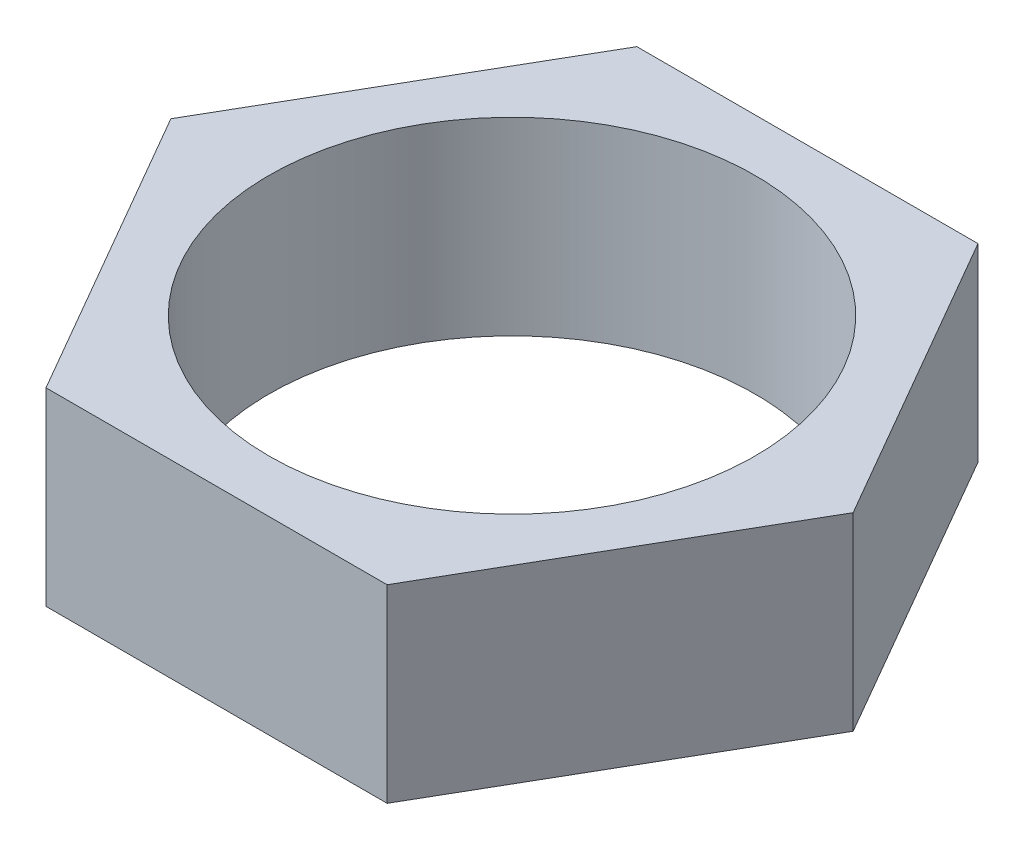
ISO-10303-21;
HEADER;
FILE_DESCRIPTION(('STEP AP214'),'2;1');
FILE_NAME('part.step','',(''),(''),'','','');
FILE_SCHEMA(('AUTOMOTIVE_DESIGN { 1 0 10303 214 1 1 1 1 }'));
ENDSEC;
DATA;
#1=APPLICATION_CONTEXT('core data for automotive mechanical design processes');
#2=APPLICATION_PROTOCOL_DEFINITION('international standard','automotive_design',2000,#1);
#3=PRODUCT_CONTEXT('',#1,'mechanical');
#4=PRODUCT('Part','Part','',(#3));
#5=PRODUCT_RELATED_PRODUCT_CATEGORY('part','',(#4));
#6=PRODUCT_DEFINITION_FORMATION('','',#4);
#7=PRODUCT_DEFINITION_CONTEXT('part definition',#1,'design');
#8=PRODUCT_DEFINITION('design','',#6,#7);
#9=PRODUCT_DEFINITION_SHAPE('','',#8);
#10=(LENGTH_UNIT() NAMED_UNIT(*) SI_UNIT(.MILLI.,.METRE.));
#11=(NAMED_UNIT(*) PLANE_ANGLE_UNIT() SI_UNIT($,.RADIAN.));
#12=(NAMED_UNIT(*) SI_UNIT($,.STERADIAN.) SOLID_ANGLE_UNIT());
#13=UNCERTAINTY_MEASURE_WITH_UNIT(LENGTH_MEASURE(1.E-05),#10,'distance_accuracy_value','');
#14=(GEOMETRIC_REPRESENTATION_CONTEXT(3) GLOBAL_UNCERTAINTY_ASSIGNED_CONTEXT((#13)) GLOBAL_UNIT_ASSIGNED_CONTEXT((#10,
#11,#12)) REPRESENTATION_CONTEXT('',''));
#15=CARTESIAN_POINT('',(0.,0.,0.));
#16=DIRECTION('',(0.,0.,1.));
#17=DIRECTION('',(1.,0.,0.));
#18=AXIS2_PLACEMENT_3D('',#15,#16,#17);
#19=CARTESIAN_POINT('',(3.59285072516704,-1.9939,-6.223));
#20=DIRECTION('',(0.,0.,-1.));
#21=DIRECTION('',(-1.,0.,0.));
#22=AXIS2_PLACEMENT_3D('',#19,#20,#21);
#23=PLANE('',#22);
#24=DIRECTION('',(0.,1.,0.));
#25=VECTOR('',#24,1.);
#26=CARTESIAN_POINT('',(-3.59285072516704,-1.9939,-6.223));
#27=LINE('',#26,#25);
#28=CARTESIAN_POINT('',(-3.59285072516704,-1.9939,-6.223));
#29=VERTEX_POINT('',#28);
#30=CARTESIAN_POINT('',(-3.59285072516704,1.9939,-6.223));
#31=VERTEX_POINT('',#30);
#32=EDGE_CURVE('E56',#29,#31,#27,.T.);
#33=ORIENTED_EDGE('',*,*,#32,.T.);
#34=DIRECTION('',(-1.,0.,0.));
#35=VECTOR('',#34,1.);
#36=CARTESIAN_POINT('',(3.59285072516704,1.9939,-6.223));
#37=LINE('',#36,#35);
#38=CARTESIAN_POINT('',(3.59285072516704,1.9939,-6.223));
#39=VERTEX_POINT('',#38);
#40=EDGE_CURVE('E105',#39,#31,#37,.T.);
#41=ORIENTED_EDGE('',*,*,#40,.F.);
#42=DIRECTION('',(0.,1.,0.));
#43=VECTOR('',#42,1.);
#44=CARTESIAN_POINT('',(3.59285072516704,-1.9939,-6.223));
#45=LINE('',#44,#43);
#46=CARTESIAN_POINT('',(3.59285072516704,-1.9939,-6.223));
#47=VERTEX_POINT('',#46);
#48=EDGE_CURVE('E11',#47,#39,#45,.T.);
#49=ORIENTED_EDGE('',*,*,#48,.F.);
#50=DIRECTION('',(-1.,0.,0.));
#51=VECTOR('',#50,1.);
#52=CARTESIAN_POINT('',(3.59285072516704,-1.9939,-6.223));
#53=LINE('',#52,#51);
#54=EDGE_CURVE('E106',#47,#29,#53,.T.);
#55=ORIENTED_EDGE('',*,*,#54,.T.);
#56=EDGE_LOOP('',(#33,#41,#49,#55));
#57=FACE_BOUND('',#56,.T.);
#58=ADVANCED_FACE('F53',(#57),#23,.T.);
#59=CARTESIAN_POINT('',(7.18570145033408,-1.9939,0.));
#60=DIRECTION('',(0.866025403784439,0.,-0.5));
#61=DIRECTION('',(-0.5,0.,-0.866025403784439));
#62=AXIS2_PLACEMENT_3D('',#59,#60,#61);
#63=PLANE('',#62);
#64=ORIENTED_EDGE('',*,*,#48,.T.);
#65=DIRECTION('',(-0.5,0.,-0.866025403784439));
#66=VECTOR('',#65,1.);
#67=CARTESIAN_POINT('',(7.18570145033408,1.9939,0.));
#68=LINE('',#67,#66);
#69=CARTESIAN_POINT('',(7.18570145033408,1.9939,0.));
#70=VERTEX_POINT('',#69);
#71=EDGE_CURVE('E124',#70,#39,#68,.T.);
#72=ORIENTED_EDGE('',*,*,#71,.F.);
#73=DIRECTION('',(0.,1.,0.));
#74=VECTOR('',#73,1.);
#75=CARTESIAN_POINT('',(7.18570145033408,-1.9939,0.));
#76=LINE('',#75,#74);
#77=CARTESIAN_POINT('',(7.18570145033408,-1.9939,0.));
#78=VERTEX_POINT('',#77);
#79=EDGE_CURVE('E61',#78,#70,#76,.T.);
#80=ORIENTED_EDGE('',*,*,#79,.F.);
#81=DIRECTION('',(-0.5,0.,-0.866025403784439));
#82=VECTOR('',#81,1.);
#83=CARTESIAN_POINT('',(7.18570145033408,-1.9939,0.));
#84=LINE('',#83,#82);
#85=EDGE_CURVE('E111',#78,#47,#84,.T.);
#86=ORIENTED_EDGE('',*,*,#85,.T.);
#87=EDGE_LOOP('',(#64,#72,#80,#86));
#88=FACE_BOUND('',#87,.T.);
#89=ADVANCED_FACE('F173',(#88),#63,.T.);
#90=CARTESIAN_POINT('',(3.59285072516705,-1.9939,6.223));
#91=DIRECTION('',(0.866025403784439,0.,0.5));
#92=DIRECTION('',(0.5,0.,-0.866025403784439));
#93=AXIS2_PLACEMENT_3D('',#90,#91,#92);
#94=PLANE('',#93);
#95=ORIENTED_EDGE('',*,*,#79,.T.);
#96=DIRECTION('',(0.5,0.,-0.866025403784439));
#97=VECTOR('',#96,1.);
#98=CARTESIAN_POINT('',(3.59285072516705,1.9939,6.223));
#99=LINE('',#98,#97);
#100=CARTESIAN_POINT('',(3.59285072516705,1.9939,6.223));
#101=VERTEX_POINT('',#100);
#102=EDGE_CURVE('E135',#101,#70,#99,.T.);
#103=ORIENTED_EDGE('',*,*,#102,.F.);
#104=DIRECTION('',(0.,1.,0.));
#105=VECTOR('',#104,1.);
#106=CARTESIAN_POINT('',(3.59285072516705,-1.9939,6.223));
#107=LINE('',#106,#105);
#108=CARTESIAN_POINT('',(3.59285072516705,-1.9939,6.223));
#109=VERTEX_POINT('',#108);
#110=EDGE_CURVE('E156',#109,#101,#107,.T.);
#111=ORIENTED_EDGE('',*,*,#110,.F.);
#112=DIRECTION('',(0.5,0.,-0.866025403784439));
#113=VECTOR('',#112,1.);
#114=CARTESIAN_POINT('',(3.59285072516705,-1.9939,6.223));
#115=LINE('',#114,#113);
#116=EDGE_CURVE('E152',#109,#78,#115,.T.);
#117=ORIENTED_EDGE('',*,*,#116,.T.);
#118=EDGE_LOOP('',(#95,#103,#111,#117));
#119=FACE_BOUND('',#118,.T.);
#120=ADVANCED_FACE('F169',(#119),#94,.T.);
#121=CARTESIAN_POINT('',(-3.59285072516704,-1.9939,6.223));
#122=DIRECTION('',(0.,0.,1.));
#123=DIRECTION('',(1.,0.,0.));
#124=AXIS2_PLACEMENT_3D('',#121,#122,#123);
#125=PLANE('',#124);
#126=ORIENTED_EDGE('',*,*,#110,.T.);
#127=DIRECTION('',(1.,0.,0.));
#128=VECTOR('',#127,1.);
#129=CARTESIAN_POINT('',(-3.59285072516704,1.9939,6.223));
#130=LINE('',#129,#128);
#131=CARTESIAN_POINT('',(-3.59285072516704,1.9939,6.223));
#132=VERTEX_POINT('',#131);
#133=EDGE_CURVE('E132',#132,#101,#130,.T.);
#134=ORIENTED_EDGE('',*,*,#133,.F.);
#135=DIRECTION('',(0.,1.,0.));
#136=VECTOR('',#135,1.);
#137=CARTESIAN_POINT('',(-3.59285072516704,-1.9939,6.223));
#138=LINE('',#137,#136);
#139=CARTESIAN_POINT('',(-3.59285072516704,-1.9939,6.223));
#140=VERTEX_POINT('',#139);
#141=EDGE_CURVE('E158',#140,#132,#138,.T.);
#142=ORIENTED_EDGE('',*,*,#141,.F.);
#143=DIRECTION('',(1.,0.,0.));
#144=VECTOR('',#143,1.);
#145=CARTESIAN_POINT('',(-3.59285072516704,-1.9939,6.223));
#146=LINE('',#145,#144);
#147=EDGE_CURVE('E148',#140,#109,#146,.T.);
#148=ORIENTED_EDGE('',*,*,#147,.T.);
#149=EDGE_LOOP('',(#126,#134,#142,#148));
#150=FACE_BOUND('',#149,.T.);
#151=ADVANCED_FACE('F166',(#150),#125,.T.);
#152=CARTESIAN_POINT('',(-7.18570145033408,-1.9939,0.));
#153=DIRECTION('',(-0.866025403784438,0.,0.5));
#154=DIRECTION('',(0.5,0.,0.866025403784438));
#155=AXIS2_PLACEMENT_3D('',#152,#153,#154);
#156=PLANE('',#155);
#157=ORIENTED_EDGE('',*,*,#141,.T.);
#158=DIRECTION('',(0.5,0.,0.866025403784438));
#159=VECTOR('',#158,1.);
#160=CARTESIAN_POINT('',(-7.18570145033408,1.9939,0.));
#161=LINE('',#160,#159);
#162=CARTESIAN_POINT('',(-7.18570145033408,1.9939,0.));
#163=VERTEX_POINT('',#162);
#164=EDGE_CURVE('E118',#163,#132,#161,.T.);
#165=ORIENTED_EDGE('',*,*,#164,.F.);
#166=DIRECTION('',(0.,1.,0.));
#167=VECTOR('',#166,1.);
#168=CARTESIAN_POINT('',(-7.18570145033408,-1.9939,0.));
#169=LINE('',#168,#167);
#170=CARTESIAN_POINT('',(-7.18570145033408,-1.9939,0.));
#171=VERTEX_POINT('',#170);
#172=EDGE_CURVE('E110',#171,#163,#169,.T.);
#173=ORIENTED_EDGE('',*,*,#172,.F.);
#174=DIRECTION('',(0.5,0.,0.866025403784438));
#175=VECTOR('',#174,1.);
#176=CARTESIAN_POINT('',(-7.18570145033408,-1.9939,0.));
#177=LINE('',#176,#175);
#178=EDGE_CURVE('E145',#171,#140,#177,.T.);
#179=ORIENTED_EDGE('',*,*,#178,.T.);
#180=EDGE_LOOP('',(#157,#165,#173,#179));
#181=FACE_BOUND('',#180,.T.);
#182=ADVANCED_FACE('F160',(#181),#156,.T.);
#183=CARTESIAN_POINT('',(-3.59285072516704,-1.9939,-6.223));
#184=DIRECTION('',(-0.866025403784439,0.,-0.5));
#185=DIRECTION('',(-0.5,0.,0.866025403784439));
#186=AXIS2_PLACEMENT_3D('',#183,#184,#185);
#187=PLANE('',#186);
#188=ORIENTED_EDGE('',*,*,#172,.T.);
#189=DIRECTION('',(-0.5,0.,0.866025403784439));
#190=VECTOR('',#189,1.);
#191=CARTESIAN_POINT('',(-3.59285072516704,1.9939,-6.223));
#192=LINE('',#191,#190);
#193=EDGE_CURVE('E113',#31,#163,#192,.T.);
#194=ORIENTED_EDGE('',*,*,#193,.F.);
#195=ORIENTED_EDGE('',*,*,#32,.F.);
#196=DIRECTION('',(-0.5,0.,0.866025403784439));
#197=VECTOR('',#196,1.);
#198=CARTESIAN_POINT('',(-3.59285072516704,-1.9939,-6.223));
#199=LINE('',#198,#197);
#200=EDGE_CURVE('E143',#29,#171,#199,.T.);
#201=ORIENTED_EDGE('',*,*,#200,.T.);
#202=EDGE_LOOP('',(#188,#194,#195,#201));
#203=FACE_BOUND('',#202,.T.);
#204=ADVANCED_FACE('F114',(#203),#187,.T.);
#205=CARTESIAN_POINT('',(0.,-1.9939,0.));
#206=DIRECTION('',(0.,1.,0.));
#207=DIRECTION('',(0.,0.,1.));
#208=AXIS2_PLACEMENT_3D('',#205,#206,#207);
#209=PLANE('',#208);
#210=CARTESIAN_POINT('',(0.,-1.9939,0.));
#211=DIRECTION('',(0.,1.,0.));
#212=DIRECTION('',(0.,0.,1.));
#213=AXIS2_PLACEMENT_3D('',#210,#211,#212);
#214=CIRCLE('',#213,5.12);
#215=CARTESIAN_POINT('',(0.,-1.9939,5.12));
#216=VERTEX_POINT('',#215);
#217=EDGE_CURVE('E139',#216,#216,#214,.T.);
#218=ORIENTED_EDGE('',*,*,#217,.T.);
#219=EDGE_LOOP('',(#218));
#220=FACE_BOUND('',#219,.T.);
#221=ORIENTED_EDGE('',*,*,#54,.F.);
#222=ORIENTED_EDGE('',*,*,#85,.F.);
#223=ORIENTED_EDGE('',*,*,#116,.F.);
#224=ORIENTED_EDGE('',*,*,#147,.F.);
#225=ORIENTED_EDGE('',*,*,#178,.F.);
#226=ORIENTED_EDGE('',*,*,#200,.F.);
#227=EDGE_LOOP('',(#221,#222,#223,#224,#225,#226));
#228=FACE_BOUND('',#227,.T.);
#229=ADVANCED_FACE('F172',(#220,#228),#209,.F.);
#230=CARTESIAN_POINT('',(0.,-1.9939,0.));
#231=DIRECTION('',(0.,1.,0.));
#232=DIRECTION('',(0.,0.,1.));
#233=AXIS2_PLACEMENT_3D('',#230,#231,#232);
#234=CYLINDRICAL_SURFACE('',#233,5.12);
#235=ORIENTED_EDGE('',*,*,#217,.F.);
#236=EDGE_LOOP('',(#235));
#237=FACE_BOUND('',#236,.T.);
#238=CARTESIAN_POINT('',(0.,1.9939,0.));
#239=DIRECTION('',(0.,1.,0.));
#240=DIRECTION('',(0.,0.,1.));
#241=AXIS2_PLACEMENT_3D('',#238,#239,#240);
#242=CIRCLE('',#241,5.12);
#243=CARTESIAN_POINT('',(0.,1.9939,5.12));
#244=VERTEX_POINT('',#243);
#245=EDGE_CURVE('E125',#244,#244,#242,.T.);
#246=ORIENTED_EDGE('',*,*,#245,.T.);
#247=EDGE_LOOP('',(#246));
#248=FACE_BOUND('',#247,.T.);
#249=ADVANCED_FACE('F191',(#237,#248),#234,.F.);
#250=CARTESIAN_POINT('',(0.,1.9939,0.));
#251=DIRECTION('',(0.,1.,0.));
#252=DIRECTION('',(0.,0.,1.));
#253=AXIS2_PLACEMENT_3D('',#250,#251,#252);
#254=PLANE('',#253);
#255=ORIENTED_EDGE('',*,*,#40,.T.);
#256=ORIENTED_EDGE('',*,*,#193,.T.);
#257=ORIENTED_EDGE('',*,*,#164,.T.);
#258=ORIENTED_EDGE('',*,*,#133,.T.);
#259=ORIENTED_EDGE('',*,*,#102,.T.);
#260=ORIENTED_EDGE('',*,*,#71,.T.);
#261=EDGE_LOOP('',(#255,#256,#257,#258,#259,#260));
#262=FACE_BOUND('',#261,.T.);
#263=ORIENTED_EDGE('',*,*,#245,.F.);
#264=EDGE_LOOP('',(#263));
#265=FACE_BOUND('',#264,.T.);
#266=ADVANCED_FACE('F121',(#262,#265),#254,.T.);
#267=CLOSED_SHELL('',(#58,#89,#120,#151,#182,#204,#229,#249,#266));
#268=MANIFOLD_SOLID_BREP('B2',#267);
#269=ADVANCED_BREP_SHAPE_REPRESENTATION('',(#18,#268),#14);
#270=SHAPE_DEFINITION_REPRESENTATION(#9,#269);
ENDSEC;
END-ISO-10303-21;
